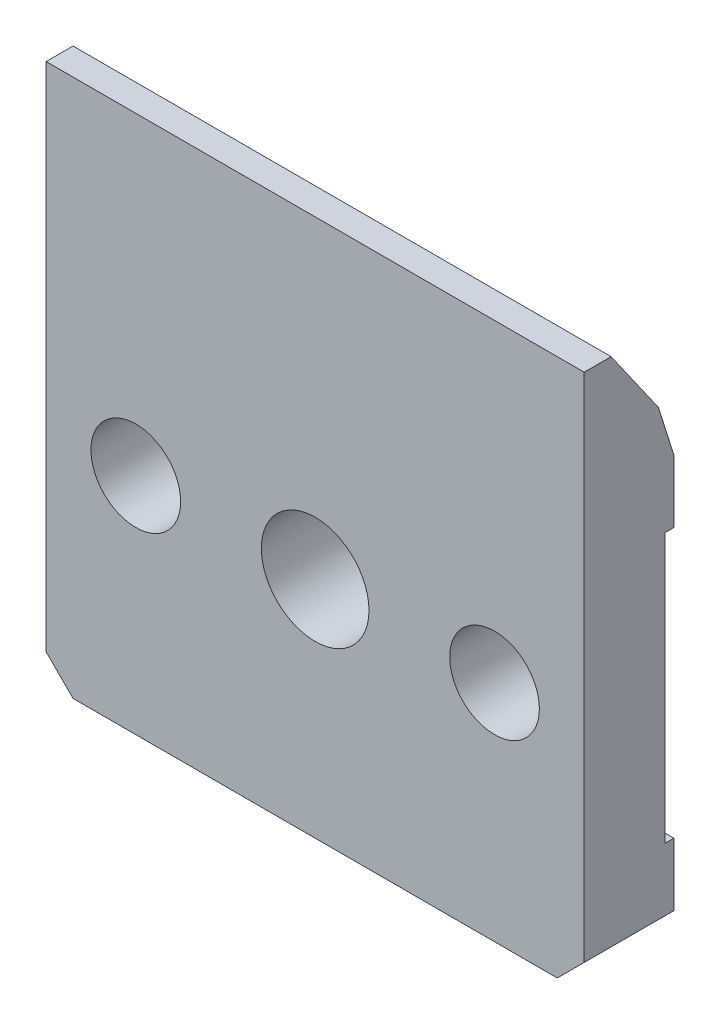
ISO-10303-21;
HEADER;
FILE_DESCRIPTION(('STEP AP214'),'2;1');
FILE_NAME('part.step','',(''),(''),'','','');
FILE_SCHEMA(('AUTOMOTIVE_DESIGN { 1 0 10303 214 1 1 1 1 }'));
ENDSEC;
DATA;
#1=APPLICATION_CONTEXT('core data for automotive mechanical design processes');
#2=APPLICATION_PROTOCOL_DEFINITION('international standard','automotive_design',2000,#1);
#3=PRODUCT_CONTEXT('',#1,'mechanical');
#4=PRODUCT('Part','Part','',(#3));
#5=PRODUCT_RELATED_PRODUCT_CATEGORY('part','',(#4));
#6=PRODUCT_DEFINITION_FORMATION('','',#4);
#7=PRODUCT_DEFINITION_CONTEXT('part definition',#1,'design');
#8=PRODUCT_DEFINITION('design','',#6,#7);
#9=PRODUCT_DEFINITION_SHAPE('','',#8);
#10=(LENGTH_UNIT() NAMED_UNIT(*) SI_UNIT(.MILLI.,.METRE.));
#11=(NAMED_UNIT(*) PLANE_ANGLE_UNIT() SI_UNIT($,.RADIAN.));
#12=(NAMED_UNIT(*) SI_UNIT($,.STERADIAN.) SOLID_ANGLE_UNIT());
#13=UNCERTAINTY_MEASURE_WITH_UNIT(LENGTH_MEASURE(1.E-05),#10,'distance_accuracy_value','');
#14=(GEOMETRIC_REPRESENTATION_CONTEXT(3) GLOBAL_UNCERTAINTY_ASSIGNED_CONTEXT((#13)) GLOBAL_UNIT_ASSIGNED_CONTEXT((#10,
#11,#12)) REPRESENTATION_CONTEXT('',''));
#15=CARTESIAN_POINT('',(0.,0.,0.));
#16=DIRECTION('',(0.,0.,1.));
#17=DIRECTION('',(1.,0.,0.));
#18=AXIS2_PLACEMENT_3D('',#15,#16,#17);
#19=CARTESIAN_POINT('',(7.45424510927131,74.1819093878608,7.));
#20=DIRECTION('',(0.,-0.573462344363329,0.81923192051904));
#21=DIRECTION('',(0.,-0.81923192051904,-0.573462344363328));
#22=AXIS2_PLACEMENT_3D('',#19,#20,#21);
#23=PLANE('',#22);
#24=DIRECTION('',(-1.,0.,0.));
#25=VECTOR('',#24,1.);
#26=CARTESIAN_POINT('',(-52.5457548907287,64.1819093878608,0.));
#27=LINE('',#26,#25);
#28=CARTESIAN_POINT('',(4.45424510927132,64.1819093878608,0.));
#29=VERTEX_POINT('',#28);
#30=CARTESIAN_POINT('',(-5.04575489072864,64.1819093878608,0.));
#31=VERTEX_POINT('',#30);
#32=EDGE_CURVE('E236',#29,#31,#27,.T.);
#33=ORIENTED_EDGE('',*,*,#32,.T.);
#34=DIRECTION('',(0.,-0.81923192051904,-0.573462344363329));
#35=VECTOR('',#34,1.);
#36=CARTESIAN_POINT('',(-5.04575489072864,74.1819093878608,7.));
#37=LINE('',#36,#35);
#38=CARTESIAN_POINT('',(-5.04575489072864,65.6104808164322,1.));
#39=VERTEX_POINT('',#38);
#40=EDGE_CURVE('E216',#31,#39,#37,.F.);
#41=ORIENTED_EDGE('',*,*,#40,.T.);
#42=DIRECTION('',(1.,0.,0.));
#43=VECTOR('',#42,1.);
#44=CARTESIAN_POINT('',(7.45424510927131,65.6104808164322,1.));
#45=LINE('',#44,#43);
#46=CARTESIAN_POINT('',(-40.0457548907286,65.6104808164322,1.));
#47=VERTEX_POINT('',#46);
#48=EDGE_CURVE('E226',#39,#47,#45,.F.);
#49=ORIENTED_EDGE('',*,*,#48,.T.);
#50=DIRECTION('',(0.,0.81923192051904,0.573462344363329));
#51=VECTOR('',#50,1.);
#52=CARTESIAN_POINT('',(-40.0457548907286,74.1819093878608,7.));
#53=LINE('',#52,#51);
#54=CARTESIAN_POINT('',(-40.0457548907286,64.1819093878608,0.));
#55=VERTEX_POINT('',#54);
#56=EDGE_CURVE('E231',#47,#55,#53,.F.);
#57=ORIENTED_EDGE('',*,*,#56,.T.);
#58=CARTESIAN_POINT('',(-49.5457548907286,64.1819093878608,0.));
#59=VERTEX_POINT('',#58);
#60=EDGE_CURVE('E391',#55,#59,#27,.T.);
#61=ORIENTED_EDGE('',*,*,#60,.T.);
#62=DIRECTION('',(0.707106781186547,-0.579284446363492,-0.405499112454445));
#63=VECTOR('',#62,1.);
#64=CARTESIAN_POINT('',(-27.1490326985955,45.8337996530682,-12.8436768143549));
#65=LINE('',#64,#63);
#66=CARTESIAN_POINT('',(-52.5457548907287,66.639605149418,1.72038703309001));
#67=VERTEX_POINT('',#66);
#68=EDGE_CURVE('E428',#59,#67,#65,.F.);
#69=ORIENTED_EDGE('',*,*,#68,.T.);
#70=DIRECTION('',(0.,-0.81923192051904,-0.573462344363328));
#71=VECTOR('',#70,1.);
#72=CARTESIAN_POINT('',(-52.5457548907287,74.1819093878608,7.));
#73=LINE('',#72,#71);
#74=CARTESIAN_POINT('',(-52.5457548907287,74.1819093878608,7.00000000000001));
#75=VERTEX_POINT('',#74);
#76=EDGE_CURVE('E308',#75,#67,#73,.T.);
#77=ORIENTED_EDGE('',*,*,#76,.F.);
#78=DIRECTION('',(-1.,0.,0.));
#79=VECTOR('',#78,1.);
#80=CARTESIAN_POINT('',(7.45424510927131,74.1819093878608,7.));
#81=LINE('',#80,#79);
#82=CARTESIAN_POINT('',(7.45424510927131,74.1819093878608,7.));
#83=VERTEX_POINT('',#82);
#84=EDGE_CURVE('E316',#83,#75,#81,.T.);
#85=ORIENTED_EDGE('',*,*,#84,.F.);
#86=DIRECTION('',(0.,-0.81923192051904,-0.573462344363328));
#87=VECTOR('',#86,1.);
#88=CARTESIAN_POINT('',(7.45424510927131,74.1819093878608,7.));
#89=LINE('',#88,#87);
#90=CARTESIAN_POINT('',(7.45424510927131,66.6396051494179,1.72038703308999));
#91=VERTEX_POINT('',#90);
#92=EDGE_CURVE('E309',#83,#91,#89,.T.);
#93=ORIENTED_EDGE('',*,*,#92,.T.);
#94=DIRECTION('',(0.707106781186547,0.579284446363493,0.405499112454445));
#95=VECTOR('',#94,1.);
#96=CARTESIAN_POINT('',(12.0575229171381,70.4107572686394,4.360193516545));
#97=LINE('',#96,#95);
#98=EDGE_CURVE('E426',#91,#29,#97,.F.);
#99=ORIENTED_EDGE('',*,*,#98,.T.);
#100=EDGE_LOOP('',(#33,#41,#49,#57,#61,#69,#77,#85,#93,#99));
#101=FACE_BOUND('',#100,.T.);
#102=ADVANCED_FACE('F41',(#101),#23,.F.);
#103=CARTESIAN_POINT('',(0.,0.,0.));
#104=DIRECTION('',(0.,0.,1.));
#105=DIRECTION('',(1.,0.,0.));
#106=AXIS2_PLACEMENT_3D('',#103,#104,#105);
#107=PLANE('',#106);
#108=DIRECTION('',(1.,0.,0.));
#109=VECTOR('',#108,1.);
#110=CARTESIAN_POINT('',(0.,63.1819093878608,0.));
#111=LINE('',#110,#109);
#112=CARTESIAN_POINT('',(-40.0457548907287,63.1819093878608,0.));
#113=VERTEX_POINT('',#112);
#114=CARTESIAN_POINT('',(-5.04575489072865,63.1819093878608,0.));
#115=VERTEX_POINT('',#114);
#116=EDGE_CURVE('E454',#113,#115,#111,.T.);
#117=ORIENTED_EDGE('',*,*,#116,.T.);
#118=DIRECTION('',(0.,1.,0.));
#119=VECTOR('',#118,1.);
#120=CARTESIAN_POINT('',(-5.04575489072865,0.,0.));
#121=LINE('',#120,#119);
#122=EDGE_CURVE('E11',#115,#31,#121,.T.);
#123=ORIENTED_EDGE('',*,*,#122,.T.);
#124=ORIENTED_EDGE('',*,*,#32,.F.);
#125=DIRECTION('',(-0.707106781186546,0.707106781186549,0.));
#126=VECTOR('',#125,1.);
#127=CARTESIAN_POINT('',(34.3180772485661,34.3180772485659,0.));
#128=LINE('',#127,#126);
#129=CARTESIAN_POINT('',(7.45424510927131,61.1819093878608,0.));
#130=VERTEX_POINT('',#129);
#131=EDGE_CURVE('E421',#130,#29,#128,.T.);
#132=ORIENTED_EDGE('',*,*,#131,.F.);
#133=DIRECTION('',(0.,1.,0.));
#134=VECTOR('',#133,1.);
#135=CARTESIAN_POINT('',(7.45424510927131,64.1819093878608,0.));
#136=LINE('',#135,#134);
#137=CARTESIAN_POINT('',(7.45424510927131,54.1819093878608,0.));
#138=VERTEX_POINT('',#137);
#139=EDGE_CURVE('E387',#138,#130,#136,.T.);
#140=ORIENTED_EDGE('',*,*,#139,.F.);
#141=DIRECTION('',(-1.,0.,0.));
#142=VECTOR('',#141,1.);
#143=CARTESIAN_POINT('',(0.,54.1819093878608,0.));
#144=LINE('',#143,#142);
#145=CARTESIAN_POINT('',(6.45424510927131,54.1819093878608,0.));
#146=VERTEX_POINT('',#145);
#147=EDGE_CURVE('E300',#138,#146,#144,.T.);
#148=ORIENTED_EDGE('',*,*,#147,.T.);
#149=DIRECTION('',(0.,-1.,0.));
#150=VECTOR('',#149,1.);
#151=CARTESIAN_POINT('',(6.45424510927131,0.,0.));
#152=LINE('',#151,#150);
#153=CARTESIAN_POINT('',(6.45424510927131,24.1819093878608,0.));
#154=VERTEX_POINT('',#153);
#155=EDGE_CURVE('E440',#146,#154,#152,.T.);
#156=ORIENTED_EDGE('',*,*,#155,.T.);
#157=DIRECTION('',(1.,0.,0.));
#158=VECTOR('',#157,1.);
#159=CARTESIAN_POINT('',(0.,24.1819093878608,0.));
#160=LINE('',#159,#158);
#161=CARTESIAN_POINT('',(7.45424510927131,24.1819093878608,0.));
#162=VERTEX_POINT('',#161);
#163=EDGE_CURVE('E305',#154,#162,#160,.T.);
#164=ORIENTED_EDGE('',*,*,#163,.T.);
#165=CARTESIAN_POINT('',(7.45424510927131,17.1819093878608,0.));
#166=VERTEX_POINT('',#165);
#167=EDGE_CURVE('E388',#166,#162,#136,.T.);
#168=ORIENTED_EDGE('',*,*,#167,.F.);
#169=DIRECTION('',(0.70710678118655,0.707106781186545,0.));
#170=VECTOR('',#169,1.);
#171=CARTESIAN_POINT('',(7.45424510927131,17.1819093878608,0.));
#172=LINE('',#171,#170);
#173=CARTESIAN_POINT('',(4.45424510927129,14.1819093878608,0.));
#174=VERTEX_POINT('',#173);
#175=EDGE_CURVE('E406',#166,#174,#172,.F.);
#176=ORIENTED_EDGE('',*,*,#175,.T.);
#177=DIRECTION('',(1.,0.,0.));
#178=VECTOR('',#177,1.);
#179=CARTESIAN_POINT('',(-52.5457548907287,14.1819093878608,0.));
#180=LINE('',#179,#178);
#181=CARTESIAN_POINT('',(-5.04575489072869,14.1819093878608,0.));
#182=VERTEX_POINT('',#181);
#183=EDGE_CURVE('E397',#182,#174,#180,.T.);
#184=ORIENTED_EDGE('',*,*,#183,.F.);
#185=DIRECTION('',(0.,1.,0.));
#186=VECTOR('',#185,1.);
#187=CARTESIAN_POINT('',(-5.04575489072869,0.,0.));
#188=LINE('',#187,#186);
#189=CARTESIAN_POINT('',(-5.04575489072869,15.1819093878608,0.));
#190=VERTEX_POINT('',#189);
#191=EDGE_CURVE('E263',#182,#190,#188,.T.);
#192=ORIENTED_EDGE('',*,*,#191,.T.);
#193=DIRECTION('',(-1.,0.,0.));
#194=VECTOR('',#193,1.);
#195=CARTESIAN_POINT('',(0.,15.1819093878608,0.));
#196=LINE('',#195,#194);
#197=CARTESIAN_POINT('',(-40.0457548907287,15.1819093878608,0.));
#198=VERTEX_POINT('',#197);
#199=EDGE_CURVE('E451',#190,#198,#196,.T.);
#200=ORIENTED_EDGE('',*,*,#199,.T.);
#201=DIRECTION('',(0.,-1.,0.));
#202=VECTOR('',#201,1.);
#203=CARTESIAN_POINT('',(-40.0457548907287,0.,0.));
#204=LINE('',#203,#202);
#205=CARTESIAN_POINT('',(-40.0457548907287,14.1819093878608,0.));
#206=VERTEX_POINT('',#205);
#207=EDGE_CURVE('E259',#198,#206,#204,.T.);
#208=ORIENTED_EDGE('',*,*,#207,.T.);
#209=CARTESIAN_POINT('',(-49.5457548907287,14.1819093878608,0.));
#210=VERTEX_POINT('',#209);
#211=EDGE_CURVE('E398',#210,#206,#180,.T.);
#212=ORIENTED_EDGE('',*,*,#211,.F.);
#213=DIRECTION('',(0.707106781186546,-0.70710678118655,0.));
#214=VECTOR('',#213,1.);
#215=CARTESIAN_POINT('',(-49.5457548907287,14.1819093878608,0.));
#216=LINE('',#215,#214);
#217=CARTESIAN_POINT('',(-52.5457548907287,17.1819093878608,0.));
#218=VERTEX_POINT('',#217);
#219=EDGE_CURVE('E409',#210,#218,#216,.F.);
#220=ORIENTED_EDGE('',*,*,#219,.T.);
#221=DIRECTION('',(0.,-1.,0.));
#222=VECTOR('',#221,1.);
#223=CARTESIAN_POINT('',(-52.5457548907287,64.1819093878608,0.));
#224=LINE('',#223,#222);
#225=CARTESIAN_POINT('',(-52.5457548907287,24.1819093878608,0.));
#226=VERTEX_POINT('',#225);
#227=EDGE_CURVE('E393',#226,#218,#224,.T.);
#228=ORIENTED_EDGE('',*,*,#227,.F.);
#229=DIRECTION('',(-1.,0.,0.));
#230=VECTOR('',#229,1.);
#231=CARTESIAN_POINT('',(0.,24.1819093878608,0.));
#232=LINE('',#231,#230);
#233=CARTESIAN_POINT('',(-51.5457548907287,24.1819093878608,0.));
#234=VERTEX_POINT('',#233);
#235=EDGE_CURVE('E65',#234,#226,#232,.T.);
#236=ORIENTED_EDGE('',*,*,#235,.F.);
#237=DIRECTION('',(0.,1.,0.));
#238=VECTOR('',#237,1.);
#239=CARTESIAN_POINT('',(-51.5457548907287,0.,0.));
#240=LINE('',#239,#238);
#241=CARTESIAN_POINT('',(-51.5457548907287,54.1819093878608,0.));
#242=VERTEX_POINT('',#241);
#243=EDGE_CURVE('E445',#234,#242,#240,.T.);
#244=ORIENTED_EDGE('',*,*,#243,.T.);
#245=DIRECTION('',(1.,0.,0.));
#246=VECTOR('',#245,1.);
#247=CARTESIAN_POINT('',(0.,54.1819093878608,0.));
#248=LINE('',#247,#246);
#249=CARTESIAN_POINT('',(-52.5457548907287,54.1819093878608,0.));
#250=VERTEX_POINT('',#249);
#251=EDGE_CURVE('E282',#250,#242,#248,.T.);
#252=ORIENTED_EDGE('',*,*,#251,.F.);
#253=CARTESIAN_POINT('',(-52.5457548907287,61.1819093878608,0.));
#254=VERTEX_POINT('',#253);
#255=EDGE_CURVE('E394',#254,#250,#224,.T.);
#256=ORIENTED_EDGE('',*,*,#255,.F.);
#257=DIRECTION('',(-0.707106781186547,-0.707106781186548,0.));
#258=VECTOR('',#257,1.);
#259=CARTESIAN_POINT('',(-56.8638321392948,56.8638321392946,0.));
#260=LINE('',#259,#258);
#261=EDGE_CURVE('E431',#59,#254,#260,.T.);
#262=ORIENTED_EDGE('',*,*,#261,.F.);
#263=ORIENTED_EDGE('',*,*,#60,.F.);
#264=DIRECTION('',(0.,-1.,0.));
#265=VECTOR('',#264,1.);
#266=CARTESIAN_POINT('',(-40.0457548907287,0.,0.));
#267=LINE('',#266,#265);
#268=EDGE_CURVE('E50',#55,#113,#267,.T.);
#269=ORIENTED_EDGE('',*,*,#268,.T.);
#270=EDGE_LOOP('',(#117,#123,#124,#132,#140,#148,#156,#164,#168,#176,#184,#192,#200,#208,#212,
#220,#228,#236,#244,#252,#256,#262,#263,#269));
#271=FACE_BOUND('',#270,.T.);
#272=CARTESIAN_POINT('',(-22.5457548907287,20.9319093878608,0.));
#273=DIRECTION('',(0.,0.,1.));
#274=DIRECTION('',(1.,0.,0.));
#275=AXIS2_PLACEMENT_3D('',#272,#273,#274);
#276=CIRCLE('',#275,4.5);
#277=CARTESIAN_POINT('',(-18.0457548907287,20.9319093878608,0.));
#278=VERTEX_POINT('',#277);
#279=EDGE_CURVE('E355',#278,#278,#276,.T.);
#280=ORIENTED_EDGE('',*,*,#279,.T.);
#281=EDGE_LOOP('',(#280));
#282=FACE_BOUND('',#281,.T.);
#283=CARTESIAN_POINT('',(-22.5457548907287,57.4319093878608,0.));
#284=DIRECTION('',(0.,0.,1.));
#285=DIRECTION('',(1.,0.,0.));
#286=AXIS2_PLACEMENT_3D('',#283,#284,#285);
#287=CIRCLE('',#286,4.5);
#288=CARTESIAN_POINT('',(-18.0457548907287,57.4319093878608,0.));
#289=VERTEX_POINT('',#288);
#290=EDGE_CURVE('E359',#289,#289,#287,.T.);
#291=ORIENTED_EDGE('',*,*,#290,.T.);
#292=EDGE_LOOP('',(#291));
#293=FACE_BOUND('',#292,.T.);
#294=CARTESIAN_POINT('',(-2.54575489072869,19.1819093878606,0.));
#295=DIRECTION('',(0.,0.,1.));
#296=DIRECTION('',(1.,0.,0.));
#297=AXIS2_PLACEMENT_3D('',#294,#295,#296);
#298=CIRCLE('',#297,3.);
#299=CARTESIAN_POINT('',(0.454245109271309,19.1819093878606,0.));
#300=VERTEX_POINT('',#299);
#301=EDGE_CURVE('E365',#300,#300,#298,.T.);
#302=ORIENTED_EDGE('',*,*,#301,.T.);
#303=EDGE_LOOP('',(#302));
#304=FACE_BOUND('',#303,.T.);
#305=CARTESIAN_POINT('',(-2.54575489072869,59.181909387861,0.));
#306=DIRECTION('',(0.,0.,1.));
#307=DIRECTION('',(1.,0.,0.));
#308=AXIS2_PLACEMENT_3D('',#305,#306,#307);
#309=CIRCLE('',#308,3.);
#310=CARTESIAN_POINT('',(0.45424510927131,59.181909387861,0.));
#311=VERTEX_POINT('',#310);
#312=EDGE_CURVE('E371',#311,#311,#309,.T.);
#313=ORIENTED_EDGE('',*,*,#312,.T.);
#314=EDGE_LOOP('',(#313));
#315=FACE_BOUND('',#314,.T.);
#316=CARTESIAN_POINT('',(-42.5457548907287,59.181909387861,0.));
#317=DIRECTION('',(0.,0.,1.));
#318=DIRECTION('',(1.,0.,0.));
#319=AXIS2_PLACEMENT_3D('',#316,#317,#318);
#320=CIRCLE('',#319,3.);
#321=CARTESIAN_POINT('',(-39.5457548907287,59.181909387861,0.));
#322=VERTEX_POINT('',#321);
#323=EDGE_CURVE('E377',#322,#322,#320,.T.);
#324=ORIENTED_EDGE('',*,*,#323,.T.);
#325=EDGE_LOOP('',(#324));
#326=FACE_BOUND('',#325,.T.);
#327=CARTESIAN_POINT('',(-42.5457548907287,19.1819093878606,0.));
#328=DIRECTION('',(0.,0.,1.));
#329=DIRECTION('',(1.,0.,0.));
#330=AXIS2_PLACEMENT_3D('',#327,#328,#329);
#331=CIRCLE('',#330,3.);
#332=CARTESIAN_POINT('',(-39.5457548907287,19.1819093878606,0.));
#333=VERTEX_POINT('',#332);
#334=EDGE_CURVE('E382',#333,#333,#331,.T.);
#335=ORIENTED_EDGE('',*,*,#334,.T.);
#336=EDGE_LOOP('',(#335));
#337=FACE_BOUND('',#336,.T.);
#338=CARTESIAN_POINT('',(-2.54575489072869,39.1819093878608,0.));
#339=DIRECTION('',(0.,0.,1.));
#340=DIRECTION('',(1.,0.,0.));
#341=AXIS2_PLACEMENT_3D('',#338,#339,#340);
#342=CIRCLE('',#341,5.00000000000001);
#343=CARTESIAN_POINT('',(2.45424510927133,39.1819093878608,0.));
#344=VERTEX_POINT('',#343);
#345=EDGE_CURVE('E340',#344,#344,#342,.T.);
#346=ORIENTED_EDGE('',*,*,#345,.T.);
#347=EDGE_LOOP('',(#346));
#348=FACE_BOUND('',#347,.T.);
#349=CARTESIAN_POINT('',(-42.5457548907287,39.1819093878608,0.));
#350=DIRECTION('',(0.,0.,1.));
#351=DIRECTION('',(1.,0.,0.));
#352=AXIS2_PLACEMENT_3D('',#349,#350,#351);
#353=CIRCLE('',#352,5.00000000000001);
#354=CARTESIAN_POINT('',(-37.5457548907287,39.1819093878608,0.));
#355=VERTEX_POINT('',#354);
#356=EDGE_CURVE('E334',#355,#355,#353,.T.);
#357=ORIENTED_EDGE('',*,*,#356,.T.);
#358=EDGE_LOOP('',(#357));
#359=FACE_BOUND('',#358,.T.);
#360=CARTESIAN_POINT('',(-22.5457548907287,39.1819093878608,0.));
#361=DIRECTION('',(0.,0.,1.));
#362=DIRECTION('',(1.,0.,0.));
#363=AXIS2_PLACEMENT_3D('',#360,#361,#362);
#364=CIRCLE('',#363,6.00000000000001);
#365=CARTESIAN_POINT('',(-16.5457548907287,39.1819093878608,0.));
#366=VERTEX_POINT('',#365);
#367=EDGE_CURVE('E328',#366,#366,#364,.T.);
#368=ORIENTED_EDGE('',*,*,#367,.T.);
#369=EDGE_LOOP('',(#368));
#370=FACE_BOUND('',#369,.T.);
#371=ADVANCED_FACE('F460',(#271,#282,#293,#304,#315,#326,#337,#348,#359,#370),#107,.F.);
#372=CARTESIAN_POINT('',(-52.5457548907287,64.1819093878608,7.));
#373=DIRECTION('',(1.,0.,0.));
#374=DIRECTION('',(0.,0.,-1.));
#375=AXIS2_PLACEMENT_3D('',#372,#373,#374);
#376=PLANE('',#375);
#377=DIRECTION('',(0.,0.,-1.));
#378=VECTOR('',#377,1.);
#379=CARTESIAN_POINT('',(-52.5457548907287,54.1819093878608,7.));
#380=LINE('',#379,#378);
#381=CARTESIAN_POINT('',(-52.5457548907287,54.1819093878608,1.));
#382=VERTEX_POINT('',#381);
#383=EDGE_CURVE('E443',#382,#250,#380,.T.);
#384=ORIENTED_EDGE('',*,*,#383,.F.);
#385=DIRECTION('',(0.,-1.,0.));
#386=VECTOR('',#385,1.);
#387=CARTESIAN_POINT('',(-52.5457548907287,24.1819093878608,1.));
#388=LINE('',#387,#386);
#389=CARTESIAN_POINT('',(-52.5457548907287,24.1819093878608,1.));
#390=VERTEX_POINT('',#389);
#391=EDGE_CURVE('E270',#382,#390,#388,.T.);
#392=ORIENTED_EDGE('',*,*,#391,.T.);
#393=DIRECTION('',(0.,0.,-1.));
#394=VECTOR('',#393,1.);
#395=CARTESIAN_POINT('',(-52.5457548907287,24.1819093878608,1.));
#396=LINE('',#395,#394);
#397=EDGE_CURVE('E266',#390,#226,#396,.T.);
#398=ORIENTED_EDGE('',*,*,#397,.T.);
#399=ORIENTED_EDGE('',*,*,#227,.T.);
#400=DIRECTION('',(0.,0.,1.));
#401=VECTOR('',#400,1.);
#402=CARTESIAN_POINT('',(-52.5457548907287,17.1819093878608,7.));
#403=LINE('',#402,#401);
#404=CARTESIAN_POINT('',(-52.5457548907287,17.1819093878608,10.));
#405=VERTEX_POINT('',#404);
#406=EDGE_CURVE('E412',#218,#405,#403,.T.);
#407=ORIENTED_EDGE('',*,*,#406,.T.);
#408=DIRECTION('',(0.,-1.,0.));
#409=VECTOR('',#408,1.);
#410=CARTESIAN_POINT('',(-52.5457548907287,64.1819093878608,10.));
#411=LINE('',#410,#409);
#412=CARTESIAN_POINT('',(-52.5457548907287,74.1819093878608,10.));
#413=VERTEX_POINT('',#412);
#414=EDGE_CURVE('E343',#413,#405,#411,.T.);
#415=ORIENTED_EDGE('',*,*,#414,.F.);
#416=DIRECTION('',(0.,0.,1.));
#417=VECTOR('',#416,1.);
#418=CARTESIAN_POINT('',(-52.5457548907287,74.1819093878608,10.));
#419=LINE('',#418,#417);
#420=EDGE_CURVE('E319',#75,#413,#419,.T.);
#421=ORIENTED_EDGE('',*,*,#420,.F.);
#422=ORIENTED_EDGE('',*,*,#76,.T.);
#423=DIRECTION('',(0.,0.953737888656795,0.300639384879093));
#424=VECTOR('',#423,1.);
#425=CARTESIAN_POINT('',(-52.5457548907287,65.917875473911,1.49288179472836));
#426=LINE('',#425,#424);
#427=EDGE_CURVE('E434',#254,#67,#426,.T.);
#428=ORIENTED_EDGE('',*,*,#427,.F.);
#429=ORIENTED_EDGE('',*,*,#255,.T.);
#430=EDGE_LOOP('',(#384,#392,#398,#399,#407,#415,#421,#422,#428,#429));
#431=FACE_BOUND('',#430,.T.);
#432=ADVANCED_FACE('F481',(#431),#376,.F.);
#433=CARTESIAN_POINT('',(7.45424510927131,64.1819093878608,7.));
#434=DIRECTION('',(-1.,0.,0.));
#435=DIRECTION('',(0.,0.,1.));
#436=AXIS2_PLACEMENT_3D('',#433,#434,#435);
#437=PLANE('',#436);
#438=ORIENTED_EDGE('',*,*,#167,.T.);
#439=DIRECTION('',(0.,0.,-1.));
#440=VECTOR('',#439,1.);
#441=CARTESIAN_POINT('',(7.45424510927131,24.1819093878608,1.));
#442=LINE('',#441,#440);
#443=CARTESIAN_POINT('',(7.45424510927131,24.1819093878608,1.));
#444=VERTEX_POINT('',#443);
#445=EDGE_CURVE('E288',#444,#162,#442,.T.);
#446=ORIENTED_EDGE('',*,*,#445,.F.);
#447=DIRECTION('',(0.,-1.,0.));
#448=VECTOR('',#447,1.);
#449=CARTESIAN_POINT('',(7.45424510927131,24.1819093878608,1.));
#450=LINE('',#449,#448);
#451=CARTESIAN_POINT('',(7.45424510927131,54.1819093878608,1.));
#452=VERTEX_POINT('',#451);
#453=EDGE_CURVE('E284',#452,#444,#450,.T.);
#454=ORIENTED_EDGE('',*,*,#453,.F.);
#455=DIRECTION('',(0.,0.,-1.));
#456=VECTOR('',#455,1.);
#457=CARTESIAN_POINT('',(7.45424510927131,54.1819093878608,7.));
#458=LINE('',#457,#456);
#459=EDGE_CURVE('E437',#452,#138,#458,.T.);
#460=ORIENTED_EDGE('',*,*,#459,.T.);
#461=ORIENTED_EDGE('',*,*,#139,.T.);
#462=DIRECTION('',(0.,-0.953737888656795,-0.300639384879093));
#463=VECTOR('',#462,1.);
#464=CARTESIAN_POINT('',(7.45424510927131,65.917875473911,1.49288179472836));
#465=LINE('',#464,#463);
#466=EDGE_CURVE('E423',#91,#130,#465,.T.);
#467=ORIENTED_EDGE('',*,*,#466,.F.);
#468=ORIENTED_EDGE('',*,*,#92,.F.);
#469=DIRECTION('',(0.,0.,-1.));
#470=VECTOR('',#469,1.);
#471=CARTESIAN_POINT('',(7.45424510927131,74.1819093878608,10.));
#472=LINE('',#471,#470);
#473=CARTESIAN_POINT('',(7.45424510927131,74.1819093878608,10.));
#474=VERTEX_POINT('',#473);
#475=EDGE_CURVE('E312',#474,#83,#472,.T.);
#476=ORIENTED_EDGE('',*,*,#475,.F.);
#477=DIRECTION('',(0.,1.,0.));
#478=VECTOR('',#477,1.);
#479=CARTESIAN_POINT('',(7.45424510927131,64.1819093878608,10.));
#480=LINE('',#479,#478);
#481=CARTESIAN_POINT('',(7.45424510927131,17.1819093878608,10.));
#482=VERTEX_POINT('',#481);
#483=EDGE_CURVE('E349',#482,#474,#480,.T.);
#484=ORIENTED_EDGE('',*,*,#483,.F.);
#485=DIRECTION('',(0.,0.,-1.));
#486=VECTOR('',#485,1.);
#487=CARTESIAN_POINT('',(7.45424510927131,17.1819093878608,7.));
#488=LINE('',#487,#486);
#489=EDGE_CURVE('E418',#482,#166,#488,.T.);
#490=ORIENTED_EDGE('',*,*,#489,.T.);
#491=EDGE_LOOP('',(#438,#446,#454,#460,#461,#467,#468,#476,#484,#490));
#492=FACE_BOUND('',#491,.T.);
#493=ADVANCED_FACE('F541',(#492),#437,.F.);
#494=CARTESIAN_POINT('',(-52.5457548907287,14.1819093878608,7.));
#495=DIRECTION('',(0.,1.,0.));
#496=DIRECTION('',(0.,0.,1.));
#497=AXIS2_PLACEMENT_3D('',#494,#495,#496);
#498=PLANE('',#497);
#499=DIRECTION('',(-1.,0.,0.));
#500=VECTOR('',#499,1.);
#501=CARTESIAN_POINT('',(-40.0457548907287,14.1819093878608,1.));
#502=LINE('',#501,#500);
#503=CARTESIAN_POINT('',(-5.04575489072869,14.1819093878608,1.));
#504=VERTEX_POINT('',#503);
#505=CARTESIAN_POINT('',(-40.0457548907287,14.1819093878608,1.));
#506=VERTEX_POINT('',#505);
#507=EDGE_CURVE('E222',#504,#506,#502,.T.);
#508=ORIENTED_EDGE('',*,*,#507,.F.);
#509=DIRECTION('',(0.,0.,-1.));
#510=VECTOR('',#509,1.);
#511=CARTESIAN_POINT('',(-5.04575489072869,14.1819093878608,7.));
#512=LINE('',#511,#510);
#513=EDGE_CURVE('E448',#504,#182,#512,.T.);
#514=ORIENTED_EDGE('',*,*,#513,.T.);
#515=ORIENTED_EDGE('',*,*,#183,.T.);
#516=DIRECTION('',(0.,0.,1.));
#517=VECTOR('',#516,1.);
#518=CARTESIAN_POINT('',(4.45424510927129,14.1819093878608,7.));
#519=LINE('',#518,#517);
#520=CARTESIAN_POINT('',(4.45424510927129,14.1819093878608,10.));
#521=VERTEX_POINT('',#520);
#522=EDGE_CURVE('E401',#174,#521,#519,.T.);
#523=ORIENTED_EDGE('',*,*,#522,.T.);
#524=DIRECTION('',(1.,0.,0.));
#525=VECTOR('',#524,1.);
#526=CARTESIAN_POINT('',(-52.5457548907287,14.1819093878608,10.));
#527=LINE('',#526,#525);
#528=CARTESIAN_POINT('',(-49.5457548907287,14.1819093878608,10.));
#529=VERTEX_POINT('',#528);
#530=EDGE_CURVE('E346',#529,#521,#527,.T.);
#531=ORIENTED_EDGE('',*,*,#530,.F.);
#532=DIRECTION('',(0.,0.,-1.));
#533=VECTOR('',#532,1.);
#534=CARTESIAN_POINT('',(-49.5457548907287,14.1819093878608,7.));
#535=LINE('',#534,#533);
#536=EDGE_CURVE('E403',#529,#210,#535,.T.);
#537=ORIENTED_EDGE('',*,*,#536,.T.);
#538=ORIENTED_EDGE('',*,*,#211,.T.);
#539=DIRECTION('',(0.,0.,-1.));
#540=VECTOR('',#539,1.);
#541=CARTESIAN_POINT('',(-40.0457548907287,14.1819093878608,-0.999999999999998));
#542=LINE('',#541,#540);
#543=EDGE_CURVE('E249',#506,#206,#542,.T.);
#544=ORIENTED_EDGE('',*,*,#543,.F.);
#545=EDGE_LOOP('',(#508,#514,#515,#523,#531,#537,#538,#544));
#546=FACE_BOUND('',#545,.T.);
#547=ADVANCED_FACE('F536',(#546),#498,.F.);
#548=CARTESIAN_POINT('',(-42.5457548907287,19.1819093878606,7.));
#549=DIRECTION('',(0.,0.,-1.));
#550=DIRECTION('',(-1.,0.,0.));
#551=AXIS2_PLACEMENT_3D('',#548,#549,#550);
#552=CYLINDRICAL_SURFACE('',#551,3.);
#553=CARTESIAN_POINT('',(-42.5457548907287,19.1819093878606,7.));
#554=DIRECTION('',(0.,0.,1.));
#555=DIRECTION('',(1.,0.,0.));
#556=AXIS2_PLACEMENT_3D('',#553,#554,#555);
#557=CIRCLE('',#556,3.);
#558=CARTESIAN_POINT('',(-39.5457548907287,19.1819093878606,7.));
#559=VERTEX_POINT('',#558);
#560=EDGE_CURVE('E374',#559,#559,#557,.T.);
#561=ORIENTED_EDGE('',*,*,#560,.T.);
#562=EDGE_LOOP('',(#561));
#563=FACE_BOUND('',#562,.T.);
#564=ORIENTED_EDGE('',*,*,#334,.F.);
#565=EDGE_LOOP('',(#564));
#566=FACE_BOUND('',#565,.T.);
#567=ADVANCED_FACE('F533',(#563,#566),#552,.F.);
#568=CARTESIAN_POINT('',(-42.5457548907287,59.181909387861,7.));
#569=DIRECTION('',(0.,0.,-1.));
#570=DIRECTION('',(-1.,0.,0.));
#571=AXIS2_PLACEMENT_3D('',#568,#569,#570);
#572=CYLINDRICAL_SURFACE('',#571,3.);
#573=CARTESIAN_POINT('',(-42.5457548907287,59.181909387861,7.));
#574=DIRECTION('',(0.,0.,1.));
#575=DIRECTION('',(1.,0.,0.));
#576=AXIS2_PLACEMENT_3D('',#573,#574,#575);
#577=CIRCLE('',#576,3.);
#578=CARTESIAN_POINT('',(-39.5457548907287,59.181909387861,7.));
#579=VERTEX_POINT('',#578);
#580=EDGE_CURVE('E368',#579,#579,#577,.T.);
#581=ORIENTED_EDGE('',*,*,#580,.T.);
#582=EDGE_LOOP('',(#581));
#583=FACE_BOUND('',#582,.T.);
#584=ORIENTED_EDGE('',*,*,#323,.F.);
#585=EDGE_LOOP('',(#584));
#586=FACE_BOUND('',#585,.T.);
#587=ADVANCED_FACE('F529',(#583,#586),#572,.F.);
#588=CARTESIAN_POINT('',(-2.54575489072869,59.181909387861,7.));
#589=DIRECTION('',(0.,0.,-1.));
#590=DIRECTION('',(-1.,0.,0.));
#591=AXIS2_PLACEMENT_3D('',#588,#589,#590);
#592=CYLINDRICAL_SURFACE('',#591,3.);
#593=CARTESIAN_POINT('',(-2.54575489072869,59.181909387861,7.));
#594=DIRECTION('',(0.,0.,1.));
#595=DIRECTION('',(1.,0.,0.));
#596=AXIS2_PLACEMENT_3D('',#593,#594,#595);
#597=CIRCLE('',#596,3.);
#598=CARTESIAN_POINT('',(0.45424510927131,59.181909387861,7.));
#599=VERTEX_POINT('',#598);
#600=EDGE_CURVE('E362',#599,#599,#597,.T.);
#601=ORIENTED_EDGE('',*,*,#600,.T.);
#602=EDGE_LOOP('',(#601));
#603=FACE_BOUND('',#602,.T.);
#604=ORIENTED_EDGE('',*,*,#312,.F.);
#605=EDGE_LOOP('',(#604));
#606=FACE_BOUND('',#605,.T.);
#607=ADVANCED_FACE('F525',(#603,#606),#592,.F.);
#608=CARTESIAN_POINT('',(-2.54575489072869,19.1819093878606,7.));
#609=DIRECTION('',(0.,0.,-1.));
#610=DIRECTION('',(-1.,0.,0.));
#611=AXIS2_PLACEMENT_3D('',#608,#609,#610);
#612=CYLINDRICAL_SURFACE('',#611,3.);
#613=CARTESIAN_POINT('',(-2.54575489072869,19.1819093878606,7.));
#614=DIRECTION('',(0.,0.,1.));
#615=DIRECTION('',(1.,0.,0.));
#616=AXIS2_PLACEMENT_3D('',#613,#614,#615);
#617=CIRCLE('',#616,3.);
#618=CARTESIAN_POINT('',(0.454245109271309,19.1819093878606,7.));
#619=VERTEX_POINT('',#618);
#620=EDGE_CURVE('E356',#619,#619,#617,.T.);
#621=ORIENTED_EDGE('',*,*,#620,.T.);
#622=EDGE_LOOP('',(#621));
#623=FACE_BOUND('',#622,.T.);
#624=ORIENTED_EDGE('',*,*,#301,.F.);
#625=EDGE_LOOP('',(#624));
#626=FACE_BOUND('',#625,.T.);
#627=ADVANCED_FACE('F521',(#623,#626),#612,.F.);
#628=CARTESIAN_POINT('',(-22.5457548907287,57.4319093878608,7.));
#629=DIRECTION('',(0.,0.,-1.));
#630=DIRECTION('',(-1.,0.,0.));
#631=AXIS2_PLACEMENT_3D('',#628,#629,#630);
#632=CYLINDRICAL_SURFACE('',#631,4.5);
#633=CARTESIAN_POINT('',(-22.5457548907287,57.4319093878608,7.));
#634=DIRECTION('',(0.,0.,1.));
#635=DIRECTION('',(1.,0.,0.));
#636=AXIS2_PLACEMENT_3D('',#633,#634,#635);
#637=CIRCLE('',#636,4.5);
#638=CARTESIAN_POINT('',(-18.0457548907287,57.4319093878608,7.));
#639=VERTEX_POINT('',#638);
#640=EDGE_CURVE('E351',#639,#639,#637,.T.);
#641=ORIENTED_EDGE('',*,*,#640,.T.);
#642=EDGE_LOOP('',(#641));
#643=FACE_BOUND('',#642,.T.);
#644=ORIENTED_EDGE('',*,*,#290,.F.);
#645=EDGE_LOOP('',(#644));
#646=FACE_BOUND('',#645,.T.);
#647=ADVANCED_FACE('F517',(#643,#646),#632,.F.);
#648=CARTESIAN_POINT('',(-22.5457548907287,20.9319093878608,7.));
#649=DIRECTION('',(0.,0.,-1.));
#650=DIRECTION('',(-1.,0.,0.));
#651=AXIS2_PLACEMENT_3D('',#648,#649,#650);
#652=CYLINDRICAL_SURFACE('',#651,4.5);
#653=CARTESIAN_POINT('',(-22.5457548907287,20.9319093878608,7.));
#654=DIRECTION('',(0.,0.,1.));
#655=DIRECTION('',(1.,0.,0.));
#656=AXIS2_PLACEMENT_3D('',#653,#654,#655);
#657=CIRCLE('',#656,4.5);
#658=CARTESIAN_POINT('',(-18.0457548907287,20.9319093878608,7.));
#659=VERTEX_POINT('',#658);
#660=EDGE_CURVE('E352',#659,#659,#657,.T.);
#661=ORIENTED_EDGE('',*,*,#660,.T.);
#662=EDGE_LOOP('',(#661));
#663=FACE_BOUND('',#662,.T.);
#664=ORIENTED_EDGE('',*,*,#279,.F.);
#665=EDGE_LOOP('',(#664));
#666=FACE_BOUND('',#665,.T.);
#667=ADVANCED_FACE('F514',(#663,#666),#652,.F.);
#668=CARTESIAN_POINT('',(0.,0.,7.));
#669=DIRECTION('',(0.,0.,1.));
#670=DIRECTION('',(1.,0.,0.));
#671=AXIS2_PLACEMENT_3D('',#668,#669,#670);
#672=PLANE('',#671);
#673=ORIENTED_EDGE('',*,*,#640,.F.);
#674=EDGE_LOOP('',(#673));
#675=FACE_BOUND('',#674,.T.);
#676=ADVANCED_FACE('F513',(#675),#672,.F.);
#677=ORIENTED_EDGE('',*,*,#600,.F.);
#678=EDGE_LOOP('',(#677));
#679=FACE_BOUND('',#678,.T.);
#680=ADVANCED_FACE('F783',(#679),#672,.F.);
#681=ORIENTED_EDGE('',*,*,#560,.F.);
#682=EDGE_LOOP('',(#681));
#683=FACE_BOUND('',#682,.T.);
#684=ADVANCED_FACE('F789',(#683),#672,.F.);
#685=ORIENTED_EDGE('',*,*,#580,.F.);
#686=EDGE_LOOP('',(#685));
#687=FACE_BOUND('',#686,.T.);
#688=ADVANCED_FACE('F796',(#687),#672,.F.);
#689=ORIENTED_EDGE('',*,*,#620,.F.);
#690=EDGE_LOOP('',(#689));
#691=FACE_BOUND('',#690,.T.);
#692=ADVANCED_FACE('F511',(#691),#672,.F.);
#693=ORIENTED_EDGE('',*,*,#660,.F.);
#694=EDGE_LOOP('',(#693));
#695=FACE_BOUND('',#694,.T.);
#696=ADVANCED_FACE('F507',(#695),#672,.F.);
#697=CARTESIAN_POINT('',(0.,0.,10.));
#698=DIRECTION('',(0.,0.,1.));
#699=DIRECTION('',(1.,0.,0.));
#700=AXIS2_PLACEMENT_3D('',#697,#698,#699);
#701=PLANE('',#700);
#702=CARTESIAN_POINT('',(-22.5457548907287,39.1819093878608,10.));
#703=DIRECTION('',(0.,0.,1.));
#704=DIRECTION('',(1.,0.,0.));
#705=AXIS2_PLACEMENT_3D('',#702,#703,#704);
#706=CIRCLE('',#705,6.00000000000001);
#707=CARTESIAN_POINT('',(-16.5457548907287,39.1819093878608,10.));
#708=VERTEX_POINT('',#707);
#709=EDGE_CURVE('E325',#708,#708,#706,.T.);
#710=ORIENTED_EDGE('',*,*,#709,.F.);
#711=EDGE_LOOP('',(#710));
#712=FACE_BOUND('',#711,.T.);
#713=CARTESIAN_POINT('',(-42.5457548907287,39.1819093878608,10.));
#714=DIRECTION('',(0.,0.,1.));
#715=DIRECTION('',(1.,0.,0.));
#716=AXIS2_PLACEMENT_3D('',#713,#714,#715);
#717=CIRCLE('',#716,5.00000000000001);
#718=CARTESIAN_POINT('',(-37.5457548907287,39.1819093878608,10.));
#719=VERTEX_POINT('',#718);
#720=EDGE_CURVE('E331',#719,#719,#717,.T.);
#721=ORIENTED_EDGE('',*,*,#720,.F.);
#722=EDGE_LOOP('',(#721));
#723=FACE_BOUND('',#722,.T.);
#724=CARTESIAN_POINT('',(-2.54575489072869,39.1819093878608,10.));
#725=DIRECTION('',(0.,0.,1.));
#726=DIRECTION('',(1.,0.,0.));
#727=AXIS2_PLACEMENT_3D('',#724,#725,#726);
#728=CIRCLE('',#727,5.00000000000001);
#729=CARTESIAN_POINT('',(2.45424510927133,39.1819093878608,10.));
#730=VERTEX_POINT('',#729);
#731=EDGE_CURVE('E337',#730,#730,#728,.T.);
#732=ORIENTED_EDGE('',*,*,#731,.F.);
#733=EDGE_LOOP('',(#732));
#734=FACE_BOUND('',#733,.T.);
#735=ORIENTED_EDGE('',*,*,#414,.T.);
#736=DIRECTION('',(-0.707106781186546,0.70710678118655,0.));
#737=VECTOR('',#736,1.);
#738=CARTESIAN_POINT('',(-17.6819227514341,-17.681922751434,10.));
#739=LINE('',#738,#737);
#740=EDGE_CURVE('E416',#405,#529,#739,.F.);
#741=ORIENTED_EDGE('',*,*,#740,.T.);
#742=ORIENTED_EDGE('',*,*,#530,.T.);
#743=DIRECTION('',(-0.70710678118655,-0.707106781186545,0.));
#744=VECTOR('',#743,1.);
#745=CARTESIAN_POINT('',(-4.86383213929477,4.86383213929479,10.));
#746=LINE('',#745,#744);
#747=EDGE_CURVE('E414',#521,#482,#746,.F.);
#748=ORIENTED_EDGE('',*,*,#747,.T.);
#749=ORIENTED_EDGE('',*,*,#483,.T.);
#750=DIRECTION('',(1.,0.,0.));
#751=VECTOR('',#750,1.);
#752=CARTESIAN_POINT('',(7.45424510927131,74.1819093878608,10.));
#753=LINE('',#752,#751);
#754=EDGE_CURVE('E322',#413,#474,#753,.T.);
#755=ORIENTED_EDGE('',*,*,#754,.F.);
#756=EDGE_LOOP('',(#735,#741,#742,#748,#749,#755));
#757=FACE_BOUND('',#756,.T.);
#758=ADVANCED_FACE('F503',(#712,#723,#734,#757),#701,.T.);
#759=CARTESIAN_POINT('',(-2.54575489072869,39.1819093878608,10.));
#760=DIRECTION('',(0.,0.,1.));
#761=DIRECTION('',(1.,0.,0.));
#762=AXIS2_PLACEMENT_3D('',#759,#760,#761);
#763=CYLINDRICAL_SURFACE('',#762,5.00000000000001);
#764=ORIENTED_EDGE('',*,*,#345,.F.);
#765=EDGE_LOOP('',(#764));
#766=FACE_BOUND('',#765,.T.);
#767=ORIENTED_EDGE('',*,*,#731,.T.);
#768=EDGE_LOOP('',(#767));
#769=FACE_BOUND('',#768,.T.);
#770=ADVANCED_FACE('F499',(#766,#769),#763,.F.);
#771=CARTESIAN_POINT('',(-42.5457548907287,39.1819093878608,10.));
#772=DIRECTION('',(0.,0.,1.));
#773=DIRECTION('',(1.,0.,0.));
#774=AXIS2_PLACEMENT_3D('',#771,#772,#773);
#775=CYLINDRICAL_SURFACE('',#774,5.00000000000001);
#776=ORIENTED_EDGE('',*,*,#356,.F.);
#777=EDGE_LOOP('',(#776));
#778=FACE_BOUND('',#777,.T.);
#779=ORIENTED_EDGE('',*,*,#720,.T.);
#780=EDGE_LOOP('',(#779));
#781=FACE_BOUND('',#780,.T.);
#782=ADVANCED_FACE('F495',(#778,#781),#775,.F.);
#783=CARTESIAN_POINT('',(-22.5457548907287,39.1819093878608,10.));
#784=DIRECTION('',(0.,0.,1.));
#785=DIRECTION('',(1.,0.,0.));
#786=AXIS2_PLACEMENT_3D('',#783,#784,#785);
#787=CYLINDRICAL_SURFACE('',#786,6.00000000000001);
#788=ORIENTED_EDGE('',*,*,#367,.F.);
#789=EDGE_LOOP('',(#788));
#790=FACE_BOUND('',#789,.T.);
#791=ORIENTED_EDGE('',*,*,#709,.T.);
#792=EDGE_LOOP('',(#791));
#793=FACE_BOUND('',#792,.T.);
#794=ADVANCED_FACE('F491',(#790,#793),#787,.F.);
#795=CARTESIAN_POINT('',(0.,74.1819093878608,0.));
#796=DIRECTION('',(0.,1.,0.));
#797=DIRECTION('',(0.,0.,1.));
#798=AXIS2_PLACEMENT_3D('',#795,#796,#797);
#799=PLANE('',#798);
#800=ORIENTED_EDGE('',*,*,#475,.T.);
#801=ORIENTED_EDGE('',*,*,#84,.T.);
#802=ORIENTED_EDGE('',*,*,#420,.T.);
#803=ORIENTED_EDGE('',*,*,#754,.T.);
#804=EDGE_LOOP('',(#800,#801,#802,#803));
#805=FACE_BOUND('',#804,.T.);
#806=ADVANCED_FACE('F487',(#805),#799,.T.);
#807=CARTESIAN_POINT('',(-49.5457548907287,14.1819093878608,7.));
#808=DIRECTION('',(0.70710678118655,0.707106781186546,0.));
#809=DIRECTION('',(0.,0.,-1.));
#810=AXIS2_PLACEMENT_3D('',#807,#808,#809);
#811=PLANE('',#810);
#812=ORIENTED_EDGE('',*,*,#740,.F.);
#813=ORIENTED_EDGE('',*,*,#406,.F.);
#814=ORIENTED_EDGE('',*,*,#219,.F.);
#815=ORIENTED_EDGE('',*,*,#536,.F.);
#816=EDGE_LOOP('',(#812,#813,#814,#815));
#817=FACE_BOUND('',#816,.T.);
#818=ADVANCED_FACE('F490',(#817),#811,.F.);
#819=CARTESIAN_POINT('',(7.45424510927131,17.1819093878608,7.));
#820=DIRECTION('',(-0.707106781186545,0.70710678118655,0.));
#821=DIRECTION('',(0.,0.,-1.));
#822=AXIS2_PLACEMENT_3D('',#819,#820,#821);
#823=PLANE('',#822);
#824=ORIENTED_EDGE('',*,*,#747,.F.);
#825=ORIENTED_EDGE('',*,*,#522,.F.);
#826=ORIENTED_EDGE('',*,*,#175,.F.);
#827=ORIENTED_EDGE('',*,*,#489,.F.);
#828=EDGE_LOOP('',(#824,#825,#826,#827));
#829=FACE_BOUND('',#828,.T.);
#830=ADVANCED_FACE('F44',(#829),#823,.F.);
#831=CARTESIAN_POINT('',(5.68938345537323,5.68938345537321,-18.0488014458543));
#832=DIRECTION('',(0.287909590078355,0.287909590078354,-0.91335433205401));
#833=DIRECTION('',(-0.953737888656794,0.,-0.300639384879094));
#834=AXIS2_PLACEMENT_3D('',#831,#832,#833);
#835=PLANE('',#834);
#836=ORIENTED_EDGE('',*,*,#466,.T.);
#837=ORIENTED_EDGE('',*,*,#131,.T.);
#838=ORIENTED_EDGE('',*,*,#98,.F.);
#839=EDGE_LOOP('',(#836,#837,#838));
#840=FACE_BOUND('',#839,.T.);
#841=ADVANCED_FACE('F485',(#840),#835,.T.);
#842=CARTESIAN_POINT('',(-9.42710582061942,9.42710582061939,-29.9062213858559));
#843=DIRECTION('',(-0.287909590078355,0.287909590078354,-0.91335433205401));
#844=DIRECTION('',(-0.953737888656794,0.,0.300639384879094));
#845=AXIS2_PLACEMENT_3D('',#842,#843,#844);
#846=PLANE('',#845);
#847=ORIENTED_EDGE('',*,*,#68,.F.);
#848=ORIENTED_EDGE('',*,*,#261,.T.);
#849=ORIENTED_EDGE('',*,*,#427,.T.);
#850=EDGE_LOOP('',(#847,#848,#849));
#851=FACE_BOUND('',#850,.T.);
#852=ADVANCED_FACE('F618',(#851),#846,.T.);
#853=CARTESIAN_POINT('',(6.45424510927131,0.,0.));
#854=DIRECTION('',(-1.,0.,0.));
#855=DIRECTION('',(0.,0.,1.));
#856=AXIS2_PLACEMENT_3D('',#853,#854,#855);
#857=PLANE('',#856);
#858=DIRECTION('',(0.,0.,1.));
#859=VECTOR('',#858,1.);
#860=CARTESIAN_POINT('',(6.45424510927131,54.1819093878608,1.));
#861=LINE('',#860,#859);
#862=CARTESIAN_POINT('',(6.45424510927131,54.1819093878608,1.));
#863=VERTEX_POINT('',#862);
#864=EDGE_CURVE('E285',#146,#863,#861,.T.);
#865=ORIENTED_EDGE('',*,*,#864,.T.);
#866=DIRECTION('',(0.,-1.,0.));
#867=VECTOR('',#866,1.);
#868=CARTESIAN_POINT('',(6.45424510927131,24.1819093878608,1.));
#869=LINE('',#868,#867);
#870=CARTESIAN_POINT('',(6.45424510927131,24.1819093878608,1.));
#871=VERTEX_POINT('',#870);
#872=EDGE_CURVE('E287',#863,#871,#869,.T.);
#873=ORIENTED_EDGE('',*,*,#872,.T.);
#874=DIRECTION('',(0.,0.,-1.));
#875=VECTOR('',#874,1.);
#876=CARTESIAN_POINT('',(6.45424510927131,24.1819093878608,1.));
#877=LINE('',#876,#875);
#878=EDGE_CURVE('E291',#871,#154,#877,.T.);
#879=ORIENTED_EDGE('',*,*,#878,.T.);
#880=ORIENTED_EDGE('',*,*,#155,.F.);
#881=EDGE_LOOP('',(#865,#873,#879,#880));
#882=FACE_BOUND('',#881,.T.);
#883=ADVANCED_FACE('F614',(#882),#857,.F.);
#884=CARTESIAN_POINT('',(6.45424510927131,24.1819093878608,1.));
#885=DIRECTION('',(0.,-1.,0.));
#886=DIRECTION('',(0.,0.,-1.));
#887=AXIS2_PLACEMENT_3D('',#884,#885,#886);
#888=PLANE('',#887);
#889=ORIENTED_EDGE('',*,*,#878,.F.);
#890=DIRECTION('',(1.,0.,0.));
#891=VECTOR('',#890,1.);
#892=CARTESIAN_POINT('',(6.45424510927131,24.1819093878608,1.));
#893=LINE('',#892,#891);
#894=EDGE_CURVE('E298',#871,#444,#893,.T.);
#895=ORIENTED_EDGE('',*,*,#894,.T.);
#896=ORIENTED_EDGE('',*,*,#445,.T.);
#897=ORIENTED_EDGE('',*,*,#163,.F.);
#898=EDGE_LOOP('',(#889,#895,#896,#897));
#899=FACE_BOUND('',#898,.T.);
#900=ADVANCED_FACE('F617',(#899),#888,.F.);
#901=CARTESIAN_POINT('',(6.45424510927131,54.1819093878608,1.));
#902=DIRECTION('',(0.,1.,0.));
#903=DIRECTION('',(0.,0.,1.));
#904=AXIS2_PLACEMENT_3D('',#901,#902,#903);
#905=PLANE('',#904);
#906=ORIENTED_EDGE('',*,*,#459,.F.);
#907=DIRECTION('',(1.,0.,0.));
#908=VECTOR('',#907,1.);
#909=CARTESIAN_POINT('',(6.45424510927131,54.1819093878608,1.));
#910=LINE('',#909,#908);
#911=EDGE_CURVE('E294',#863,#452,#910,.T.);
#912=ORIENTED_EDGE('',*,*,#911,.F.);
#913=ORIENTED_EDGE('',*,*,#864,.F.);
#914=ORIENTED_EDGE('',*,*,#147,.F.);
#915=EDGE_LOOP('',(#906,#912,#913,#914));
#916=FACE_BOUND('',#915,.T.);
#917=ADVANCED_FACE('F622',(#916),#905,.F.);
#918=CARTESIAN_POINT('',(6.45424510927131,24.1819093878608,1.));
#919=DIRECTION('',(0.,0.,1.));
#920=DIRECTION('',(1.,0.,0.));
#921=AXIS2_PLACEMENT_3D('',#918,#919,#920);
#922=PLANE('',#921);
#923=ORIENTED_EDGE('',*,*,#453,.T.);
#924=ORIENTED_EDGE('',*,*,#894,.F.);
#925=ORIENTED_EDGE('',*,*,#872,.F.);
#926=ORIENTED_EDGE('',*,*,#911,.T.);
#927=EDGE_LOOP('',(#923,#924,#925,#926));
#928=FACE_BOUND('',#927,.T.);
#929=ADVANCED_FACE('F602',(#928),#922,.F.);
#930=CARTESIAN_POINT('',(-51.5457548907287,0.,0.));
#931=DIRECTION('',(1.,0.,0.));
#932=DIRECTION('',(0.,0.,1.));
#933=AXIS2_PLACEMENT_3D('',#930,#931,#932);
#934=PLANE('',#933);
#935=DIRECTION('',(0.,0.,-1.));
#936=VECTOR('',#935,1.);
#937=CARTESIAN_POINT('',(-51.5457548907287,24.1819093878608,1.));
#938=LINE('',#937,#936);
#939=CARTESIAN_POINT('',(-51.5457548907287,24.1819093878608,1.));
#940=VERTEX_POINT('',#939);
#941=EDGE_CURVE('E267',#940,#234,#938,.T.);
#942=ORIENTED_EDGE('',*,*,#941,.F.);
#943=DIRECTION('',(0.,-1.,0.));
#944=VECTOR('',#943,1.);
#945=CARTESIAN_POINT('',(-51.5457548907287,24.1819093878608,1.));
#946=LINE('',#945,#944);
#947=CARTESIAN_POINT('',(-51.5457548907287,54.1819093878608,1.));
#948=VERTEX_POINT('',#947);
#949=EDGE_CURVE('E269',#948,#940,#946,.T.);
#950=ORIENTED_EDGE('',*,*,#949,.F.);
#951=DIRECTION('',(0.,0.,1.));
#952=VECTOR('',#951,1.);
#953=CARTESIAN_POINT('',(-51.5457548907287,54.1819093878608,1.));
#954=LINE('',#953,#952);
#955=EDGE_CURVE('E272',#242,#948,#954,.T.);
#956=ORIENTED_EDGE('',*,*,#955,.F.);
#957=ORIENTED_EDGE('',*,*,#243,.F.);
#958=EDGE_LOOP('',(#942,#950,#956,#957));
#959=FACE_BOUND('',#958,.T.);
#960=ADVANCED_FACE('F598',(#959),#934,.F.);
#961=CARTESIAN_POINT('',(-51.5457548907287,54.1819093878608,1.));
#962=DIRECTION('',(0.,-1.,0.));
#963=DIRECTION('',(0.,0.,-1.));
#964=AXIS2_PLACEMENT_3D('',#961,#962,#963);
#965=PLANE('',#964);
#966=ORIENTED_EDGE('',*,*,#251,.T.);
#967=ORIENTED_EDGE('',*,*,#955,.T.);
#968=DIRECTION('',(-1.,0.,0.));
#969=VECTOR('',#968,1.);
#970=CARTESIAN_POINT('',(-51.5457548907287,54.1819093878608,1.));
#971=LINE('',#970,#969);
#972=EDGE_CURVE('E278',#948,#382,#971,.T.);
#973=ORIENTED_EDGE('',*,*,#972,.T.);
#974=ORIENTED_EDGE('',*,*,#383,.T.);
#975=EDGE_LOOP('',(#966,#967,#973,#974));
#976=FACE_BOUND('',#975,.T.);
#977=ADVANCED_FACE('F601',(#976),#965,.T.);
#978=CARTESIAN_POINT('',(-51.5457548907287,24.1819093878608,1.));
#979=DIRECTION('',(0.,1.,0.));
#980=DIRECTION('',(0.,0.,1.));
#981=AXIS2_PLACEMENT_3D('',#978,#979,#980);
#982=PLANE('',#981);
#983=ORIENTED_EDGE('',*,*,#235,.T.);
#984=ORIENTED_EDGE('',*,*,#397,.F.);
#985=DIRECTION('',(-1.,0.,0.));
#986=VECTOR('',#985,1.);
#987=CARTESIAN_POINT('',(-51.5457548907287,24.1819093878608,1.));
#988=LINE('',#987,#986);
#989=EDGE_CURVE('E274',#940,#390,#988,.T.);
#990=ORIENTED_EDGE('',*,*,#989,.F.);
#991=ORIENTED_EDGE('',*,*,#941,.T.);
#992=EDGE_LOOP('',(#983,#984,#990,#991));
#993=FACE_BOUND('',#992,.T.);
#994=ADVANCED_FACE('F606',(#993),#982,.T.);
#995=CARTESIAN_POINT('',(-51.5457548907287,24.1819093878608,1.));
#996=DIRECTION('',(0.,0.,-1.));
#997=DIRECTION('',(-1.,0.,0.));
#998=AXIS2_PLACEMENT_3D('',#995,#996,#997);
#999=PLANE('',#998);
#1000=ORIENTED_EDGE('',*,*,#391,.F.);
#1001=ORIENTED_EDGE('',*,*,#972,.F.);
#1002=ORIENTED_EDGE('',*,*,#949,.T.);
#1003=ORIENTED_EDGE('',*,*,#989,.T.);
#1004=EDGE_LOOP('',(#1000,#1001,#1002,#1003));
#1005=FACE_BOUND('',#1004,.T.);
#1006=ADVANCED_FACE('F608',(#1005),#999,.T.);
#1007=CARTESIAN_POINT('',(0.,15.1819093878608,0.));
#1008=DIRECTION('',(0.,1.,0.));
#1009=DIRECTION('',(0.,0.,1.));
#1010=AXIS2_PLACEMENT_3D('',#1007,#1008,#1009);
#1011=PLANE('',#1010);
#1012=DIRECTION('',(0.,0.,1.));
#1013=VECTOR('',#1012,1.);
#1014=CARTESIAN_POINT('',(-5.04575489072869,15.1819093878608,-0.999999999999998));
#1015=LINE('',#1014,#1013);
#1016=CARTESIAN_POINT('',(-5.04575489072869,15.1819093878608,1.));
#1017=VERTEX_POINT('',#1016);
#1018=EDGE_CURVE('E246',#190,#1017,#1015,.T.);
#1019=ORIENTED_EDGE('',*,*,#1018,.T.);
#1020=DIRECTION('',(-1.,0.,0.));
#1021=VECTOR('',#1020,1.);
#1022=CARTESIAN_POINT('',(-40.0457548907287,15.1819093878608,1.));
#1023=LINE('',#1022,#1021);
#1024=CARTESIAN_POINT('',(-40.0457548907287,15.1819093878608,1.));
#1025=VERTEX_POINT('',#1024);
#1026=EDGE_CURVE('E248',#1017,#1025,#1023,.T.);
#1027=ORIENTED_EDGE('',*,*,#1026,.T.);
#1028=DIRECTION('',(0.,0.,-1.));
#1029=VECTOR('',#1028,1.);
#1030=CARTESIAN_POINT('',(-40.0457548907287,15.1819093878608,-0.999999999999998));
#1031=LINE('',#1030,#1029);
#1032=EDGE_CURVE('E252',#1025,#198,#1031,.T.);
#1033=ORIENTED_EDGE('',*,*,#1032,.T.);
#1034=ORIENTED_EDGE('',*,*,#199,.F.);
#1035=EDGE_LOOP('',(#1019,#1027,#1033,#1034));
#1036=FACE_BOUND('',#1035,.T.);
#1037=ADVANCED_FACE('F596',(#1036),#1011,.F.);
#1038=CARTESIAN_POINT('',(-5.04575489072869,15.1819093878608,-0.999999999999998));
#1039=DIRECTION('',(1.,0.,0.));
#1040=DIRECTION('',(0.,0.,-1.));
#1041=AXIS2_PLACEMENT_3D('',#1038,#1039,#1040);
#1042=PLANE('',#1041);
#1043=ORIENTED_EDGE('',*,*,#513,.F.);
#1044=DIRECTION('',(0.,-1.,0.));
#1045=VECTOR('',#1044,1.);
#1046=CARTESIAN_POINT('',(-5.04575489072869,15.1819093878608,1.));
#1047=LINE('',#1046,#1045);
#1048=EDGE_CURVE('E57',#1017,#504,#1047,.T.);
#1049=ORIENTED_EDGE('',*,*,#1048,.F.);
#1050=ORIENTED_EDGE('',*,*,#1018,.F.);
#1051=ORIENTED_EDGE('',*,*,#191,.F.);
#1052=EDGE_LOOP('',(#1043,#1049,#1050,#1051));
#1053=FACE_BOUND('',#1052,.T.);
#1054=ADVANCED_FACE('F590',(#1053),#1042,.F.);
#1055=CARTESIAN_POINT('',(-40.0457548907287,15.1819093878608,-0.999999999999998));
#1056=DIRECTION('',(-1.,0.,0.));
#1057=DIRECTION('',(0.,0.,1.));
#1058=AXIS2_PLACEMENT_3D('',#1055,#1056,#1057);
#1059=PLANE('',#1058);
#1060=ORIENTED_EDGE('',*,*,#1032,.F.);
#1061=DIRECTION('',(0.,-1.,0.));
#1062=VECTOR('',#1061,1.);
#1063=CARTESIAN_POINT('',(-40.0457548907287,15.1819093878608,1.));
#1064=LINE('',#1063,#1062);
#1065=EDGE_CURVE('E257',#1025,#506,#1064,.T.);
#1066=ORIENTED_EDGE('',*,*,#1065,.T.);
#1067=ORIENTED_EDGE('',*,*,#543,.T.);
#1068=ORIENTED_EDGE('',*,*,#207,.F.);
#1069=EDGE_LOOP('',(#1060,#1066,#1067,#1068));
#1070=FACE_BOUND('',#1069,.T.);
#1071=ADVANCED_FACE('F580',(#1070),#1059,.F.);
#1072=CARTESIAN_POINT('',(-40.0457548907287,15.1819093878608,1.));
#1073=DIRECTION('',(0.,0.,1.));
#1074=DIRECTION('',(1.,0.,0.));
#1075=AXIS2_PLACEMENT_3D('',#1072,#1073,#1074);
#1076=PLANE('',#1075);
#1077=ORIENTED_EDGE('',*,*,#507,.T.);
#1078=ORIENTED_EDGE('',*,*,#1065,.F.);
#1079=ORIENTED_EDGE('',*,*,#1026,.F.);
#1080=ORIENTED_EDGE('',*,*,#1048,.T.);
#1081=EDGE_LOOP('',(#1077,#1078,#1079,#1080));
#1082=FACE_BOUND('',#1081,.T.);
#1083=ADVANCED_FACE('F581',(#1082),#1076,.F.);
#1084=CARTESIAN_POINT('',(-5.04575489072865,63.1819093878608,1.));
#1085=DIRECTION('',(1.,0.,0.));
#1086=DIRECTION('',(0.,0.,-1.));
#1087=AXIS2_PLACEMENT_3D('',#1084,#1085,#1086);
#1088=PLANE('',#1087);
#1089=DIRECTION('',(0.,0.,-1.));
#1090=VECTOR('',#1089,1.);
#1091=CARTESIAN_POINT('',(-5.04575489072865,63.1819093878608,1.));
#1092=LINE('',#1091,#1090);
#1093=CARTESIAN_POINT('',(-5.04575489072865,63.1819093878608,1.));
#1094=VERTEX_POINT('',#1093);
#1095=EDGE_CURVE('E218',#1094,#115,#1092,.T.);
#1096=ORIENTED_EDGE('',*,*,#1095,.F.);
#1097=DIRECTION('',(0.,1.,0.));
#1098=VECTOR('',#1097,1.);
#1099=CARTESIAN_POINT('',(-5.04575489072865,63.1819093878608,1.));
#1100=LINE('',#1099,#1098);
#1101=EDGE_CURVE('E212',#1094,#39,#1100,.T.);
#1102=ORIENTED_EDGE('',*,*,#1101,.T.);
#1103=ORIENTED_EDGE('',*,*,#40,.F.);
#1104=ORIENTED_EDGE('',*,*,#122,.F.);
#1105=EDGE_LOOP('',(#1096,#1102,#1103,#1104));
#1106=FACE_BOUND('',#1105,.T.);
#1107=ADVANCED_FACE('F214',(#1106),#1088,.F.);
#1108=CARTESIAN_POINT('',(-40.0457548907287,63.1819093878608,1.));
#1109=DIRECTION('',(-1.,0.,0.));
#1110=DIRECTION('',(0.,0.,1.));
#1111=AXIS2_PLACEMENT_3D('',#1108,#1109,#1110);
#1112=PLANE('',#1111);
#1113=ORIENTED_EDGE('',*,*,#268,.F.);
#1114=ORIENTED_EDGE('',*,*,#56,.F.);
#1115=DIRECTION('',(0.,1.,0.));
#1116=VECTOR('',#1115,1.);
#1117=CARTESIAN_POINT('',(-40.0457548907287,63.1819093878608,1.));
#1118=LINE('',#1117,#1116);
#1119=CARTESIAN_POINT('',(-40.0457548907287,63.1819093878608,1.));
#1120=VERTEX_POINT('',#1119);
#1121=EDGE_CURVE('E223',#1120,#47,#1118,.T.);
#1122=ORIENTED_EDGE('',*,*,#1121,.F.);
#1123=DIRECTION('',(0.,0.,1.));
#1124=VECTOR('',#1123,1.);
#1125=CARTESIAN_POINT('',(-40.0457548907287,63.1819093878608,1.));
#1126=LINE('',#1125,#1124);
#1127=EDGE_CURVE('E238',#113,#1120,#1126,.T.);
#1128=ORIENTED_EDGE('',*,*,#1127,.F.);
#1129=EDGE_LOOP('',(#1113,#1114,#1122,#1128));
#1130=FACE_BOUND('',#1129,.T.);
#1131=ADVANCED_FACE('F465',(#1130),#1112,.F.);
#1132=CARTESIAN_POINT('',(0.,63.1819093878608,0.));
#1133=DIRECTION('',(0.,-1.,0.));
#1134=DIRECTION('',(0.,0.,-1.));
#1135=AXIS2_PLACEMENT_3D('',#1132,#1133,#1134);
#1136=PLANE('',#1135);
#1137=ORIENTED_EDGE('',*,*,#1127,.T.);
#1138=DIRECTION('',(1.,0.,0.));
#1139=VECTOR('',#1138,1.);
#1140=CARTESIAN_POINT('',(-40.0457548907287,63.1819093878608,1.));
#1141=LINE('',#1140,#1139);
#1142=EDGE_CURVE('E243',#1120,#1094,#1141,.T.);
#1143=ORIENTED_EDGE('',*,*,#1142,.T.);
#1144=ORIENTED_EDGE('',*,*,#1095,.T.);
#1145=ORIENTED_EDGE('',*,*,#116,.F.);
#1146=EDGE_LOOP('',(#1137,#1143,#1144,#1145));
#1147=FACE_BOUND('',#1146,.T.);
#1148=ADVANCED_FACE('F467',(#1147),#1136,.F.);
#1149=CARTESIAN_POINT('',(-40.0457548907287,63.1819093878608,1.));
#1150=DIRECTION('',(0.,0.,1.));
#1151=DIRECTION('',(1.,0.,0.));
#1152=AXIS2_PLACEMENT_3D('',#1149,#1150,#1151);
#1153=PLANE('',#1152);
#1154=ORIENTED_EDGE('',*,*,#1121,.T.);
#1155=ORIENTED_EDGE('',*,*,#48,.F.);
#1156=ORIENTED_EDGE('',*,*,#1101,.F.);
#1157=ORIENTED_EDGE('',*,*,#1142,.F.);
#1158=EDGE_LOOP('',(#1154,#1155,#1156,#1157));
#1159=FACE_BOUND('',#1158,.T.);
#1160=ADVANCED_FACE('F227',(#1159),#1153,.F.);
#1161=CLOSED_SHELL('',(#102,#371,#432,#493,#547,#567,#587,#607,#627,#647,#667,#676,#680,#684,
#688,#692,#696,#758,#770,#782,#794,#806,#818,#830,#841,#852,#883,#900,#917,#929,#960,#977,#994,
#1006,#1037,#1054,#1071,#1083,#1107,#1131,#1148,#1160));
#1162=MANIFOLD_SOLID_BREP('B2',#1161);
#1163=ADVANCED_BREP_SHAPE_REPRESENTATION('',(#18,#1162),#14);
#1164=SHAPE_DEFINITION_REPRESENTATION(#9,#1163);
ENDSEC;
END-ISO-10303-21;
